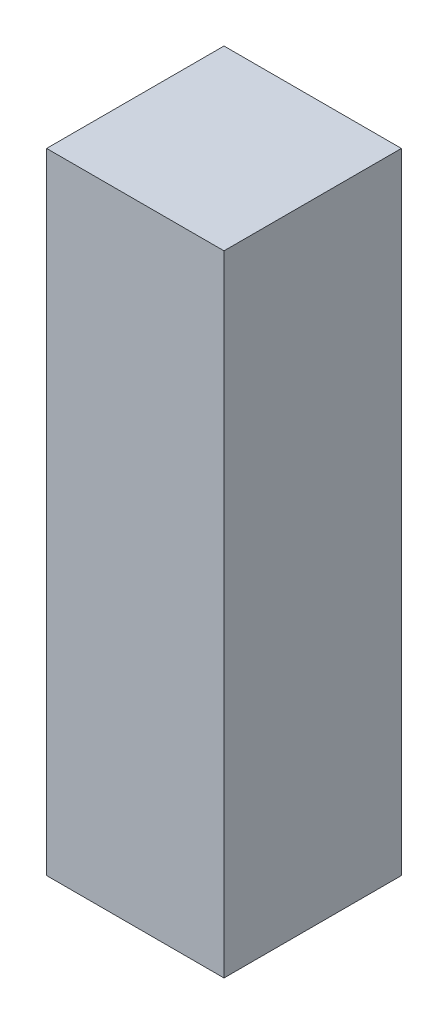
ISO-10303-21;
HEADER;
FILE_DESCRIPTION(('STEP AP214'),'2;1');
FILE_NAME('part.step','',(''),(''),'','','');
FILE_SCHEMA(('AUTOMOTIVE_DESIGN { 1 0 10303 214 1 1 1 1 }'));
ENDSEC;
DATA;
#1=APPLICATION_CONTEXT('core data for automotive mechanical design processes');
#2=APPLICATION_PROTOCOL_DEFINITION('international standard','automotive_design',2000,#1);
#3=PRODUCT_CONTEXT('',#1,'mechanical');
#4=PRODUCT('Part','Part','',(#3));
#5=PRODUCT_RELATED_PRODUCT_CATEGORY('part','',(#4));
#6=PRODUCT_DEFINITION_FORMATION('','',#4);
#7=PRODUCT_DEFINITION_CONTEXT('part definition',#1,'design');
#8=PRODUCT_DEFINITION('design','',#6,#7);
#9=PRODUCT_DEFINITION_SHAPE('','',#8);
#10=(LENGTH_UNIT() NAMED_UNIT(*) SI_UNIT(.MILLI.,.METRE.));
#11=(NAMED_UNIT(*) PLANE_ANGLE_UNIT() SI_UNIT($,.RADIAN.));
#12=(NAMED_UNIT(*) SI_UNIT($,.STERADIAN.) SOLID_ANGLE_UNIT());
#13=UNCERTAINTY_MEASURE_WITH_UNIT(LENGTH_MEASURE(1.E-05),#10,'distance_accuracy_value','');
#14=(GEOMETRIC_REPRESENTATION_CONTEXT(3) GLOBAL_UNCERTAINTY_ASSIGNED_CONTEXT((#13)) GLOBAL_UNIT_ASSIGNED_CONTEXT((#10,
#11,#12)) REPRESENTATION_CONTEXT('',''));
#15=CARTESIAN_POINT('',(0.,0.,0.));
#16=DIRECTION('',(0.,0.,1.));
#17=DIRECTION('',(1.,0.,0.));
#18=AXIS2_PLACEMENT_3D('',#15,#16,#17);
#19=CARTESIAN_POINT('',(0.,17.75,0.));
#20=DIRECTION('',(1.,0.,0.));
#21=DIRECTION('',(0.,0.,-1.));
#22=AXIS2_PLACEMENT_3D('',#19,#20,#21);
#23=PLANE('',#22);
#24=DIRECTION('',(0.,0.,1.));
#25=VECTOR('',#24,1.);
#26=CARTESIAN_POINT('',(0.,0.,0.));
#27=LINE('',#26,#25);
#28=CARTESIAN_POINT('',(0.,0.,-5.));
#29=VERTEX_POINT('',#28);
#30=CARTESIAN_POINT('',(0.,0.,0.));
#31=VERTEX_POINT('',#30);
#32=EDGE_CURVE('E102',#29,#31,#27,.T.);
#33=ORIENTED_EDGE('',*,*,#32,.T.);
#34=DIRECTION('',(0.,-1.,0.));
#35=VECTOR('',#34,1.);
#36=CARTESIAN_POINT('',(0.,17.75,0.));
#37=LINE('',#36,#35);
#38=CARTESIAN_POINT('',(0.,17.75,0.));
#39=VERTEX_POINT('',#38);
#40=EDGE_CURVE('E11',#39,#31,#37,.T.);
#41=ORIENTED_EDGE('',*,*,#40,.F.);
#42=DIRECTION('',(0.,0.,1.));
#43=VECTOR('',#42,1.);
#44=CARTESIAN_POINT('',(0.,17.75,0.));
#45=LINE('',#44,#43);
#46=CARTESIAN_POINT('',(0.,17.75,-5.));
#47=VERTEX_POINT('',#46);
#48=EDGE_CURVE('E90',#47,#39,#45,.T.);
#49=ORIENTED_EDGE('',*,*,#48,.F.);
#50=DIRECTION('',(0.,-1.,0.));
#51=VECTOR('',#50,1.);
#52=CARTESIAN_POINT('',(0.,17.75,-5.));
#53=LINE('',#52,#51);
#54=EDGE_CURVE('E98',#47,#29,#53,.T.);
#55=ORIENTED_EDGE('',*,*,#54,.T.);
#56=EDGE_LOOP('',(#33,#41,#49,#55));
#57=FACE_BOUND('',#56,.T.);
#58=ADVANCED_FACE('F39',(#57),#23,.F.);
#59=CARTESIAN_POINT('',(0.,17.75,0.));
#60=DIRECTION('',(0.,0.,-1.));
#61=DIRECTION('',(-1.,0.,0.));
#62=AXIS2_PLACEMENT_3D('',#59,#60,#61);
#63=PLANE('',#62);
#64=DIRECTION('',(1.,0.,0.));
#65=VECTOR('',#64,1.);
#66=CARTESIAN_POINT('',(0.,0.,0.));
#67=LINE('',#66,#65);
#68=CARTESIAN_POINT('',(5.,0.,0.));
#69=VERTEX_POINT('',#68);
#70=EDGE_CURVE('E94',#31,#69,#67,.T.);
#71=ORIENTED_EDGE('',*,*,#70,.T.);
#72=DIRECTION('',(0.,-1.,0.));
#73=VECTOR('',#72,1.);
#74=CARTESIAN_POINT('',(5.,17.75,0.));
#75=LINE('',#74,#73);
#76=CARTESIAN_POINT('',(5.,17.75,0.));
#77=VERTEX_POINT('',#76);
#78=EDGE_CURVE('E47',#77,#69,#75,.T.);
#79=ORIENTED_EDGE('',*,*,#78,.F.);
#80=DIRECTION('',(1.,0.,0.));
#81=VECTOR('',#80,1.);
#82=CARTESIAN_POINT('',(0.,17.75,0.));
#83=LINE('',#82,#81);
#84=EDGE_CURVE('E85',#39,#77,#83,.T.);
#85=ORIENTED_EDGE('',*,*,#84,.F.);
#86=ORIENTED_EDGE('',*,*,#40,.T.);
#87=EDGE_LOOP('',(#71,#79,#85,#86));
#88=FACE_BOUND('',#87,.T.);
#89=ADVANCED_FACE('F93',(#88),#63,.F.);
#90=CARTESIAN_POINT('',(5.,17.75,0.));
#91=DIRECTION('',(-1.,0.,0.));
#92=DIRECTION('',(0.,0.,1.));
#93=AXIS2_PLACEMENT_3D('',#90,#91,#92);
#94=PLANE('',#93);
#95=DIRECTION('',(0.,0.,-1.));
#96=VECTOR('',#95,1.);
#97=CARTESIAN_POINT('',(5.,0.,0.));
#98=LINE('',#97,#96);
#99=CARTESIAN_POINT('',(5.,0.,-5.));
#100=VERTEX_POINT('',#99);
#101=EDGE_CURVE('E72',#69,#100,#98,.T.);
#102=ORIENTED_EDGE('',*,*,#101,.T.);
#103=DIRECTION('',(0.,-1.,0.));
#104=VECTOR('',#103,1.);
#105=CARTESIAN_POINT('',(5.,17.75,-5.));
#106=LINE('',#105,#104);
#107=CARTESIAN_POINT('',(5.,17.75,-5.));
#108=VERTEX_POINT('',#107);
#109=EDGE_CURVE('E95',#108,#100,#106,.T.);
#110=ORIENTED_EDGE('',*,*,#109,.F.);
#111=DIRECTION('',(0.,0.,-1.));
#112=VECTOR('',#111,1.);
#113=CARTESIAN_POINT('',(5.,17.75,0.));
#114=LINE('',#113,#112);
#115=EDGE_CURVE('E88',#77,#108,#114,.T.);
#116=ORIENTED_EDGE('',*,*,#115,.F.);
#117=ORIENTED_EDGE('',*,*,#78,.T.);
#118=EDGE_LOOP('',(#102,#110,#116,#117));
#119=FACE_BOUND('',#118,.T.);
#120=ADVANCED_FACE('F96',(#119),#94,.F.);
#121=CARTESIAN_POINT('',(0.,17.75,-5.));
#122=DIRECTION('',(0.,0.,1.));
#123=DIRECTION('',(1.,0.,0.));
#124=AXIS2_PLACEMENT_3D('',#121,#122,#123);
#125=PLANE('',#124);
#126=DIRECTION('',(-1.,0.,0.));
#127=VECTOR('',#126,1.);
#128=CARTESIAN_POINT('',(0.,0.,-5.));
#129=LINE('',#128,#127);
#130=EDGE_CURVE('E78',#100,#29,#129,.T.);
#131=ORIENTED_EDGE('',*,*,#130,.T.);
#132=ORIENTED_EDGE('',*,*,#54,.F.);
#133=DIRECTION('',(-1.,0.,0.));
#134=VECTOR('',#133,1.);
#135=CARTESIAN_POINT('',(0.,17.75,-5.));
#136=LINE('',#135,#134);
#137=EDGE_CURVE('E55',#108,#47,#136,.T.);
#138=ORIENTED_EDGE('',*,*,#137,.F.);
#139=ORIENTED_EDGE('',*,*,#109,.T.);
#140=EDGE_LOOP('',(#131,#132,#138,#139));
#141=FACE_BOUND('',#140,.T.);
#142=ADVANCED_FACE('F109',(#141),#125,.F.);
#143=CARTESIAN_POINT('',(0.,17.75,0.));
#144=DIRECTION('',(0.,-1.,0.));
#145=DIRECTION('',(0.,0.,-1.));
#146=AXIS2_PLACEMENT_3D('',#143,#144,#145);
#147=PLANE('',#146);
#148=ORIENTED_EDGE('',*,*,#48,.T.);
#149=ORIENTED_EDGE('',*,*,#84,.T.);
#150=ORIENTED_EDGE('',*,*,#115,.T.);
#151=ORIENTED_EDGE('',*,*,#137,.T.);
#152=EDGE_LOOP('',(#148,#149,#150,#151));
#153=FACE_BOUND('',#152,.T.);
#154=ADVANCED_FACE('F86',(#153),#147,.F.);
#155=CARTESIAN_POINT('',(0.,0.,0.));
#156=DIRECTION('',(0.,-1.,0.));
#157=DIRECTION('',(0.,0.,-1.));
#158=AXIS2_PLACEMENT_3D('',#155,#156,#157);
#159=PLANE('',#158);
#160=ORIENTED_EDGE('',*,*,#32,.F.);
#161=ORIENTED_EDGE('',*,*,#130,.F.);
#162=ORIENTED_EDGE('',*,*,#101,.F.);
#163=ORIENTED_EDGE('',*,*,#70,.F.);
#164=EDGE_LOOP('',(#160,#161,#162,#163));
#165=FACE_BOUND('',#164,.T.);
#166=ADVANCED_FACE('F112',(#165),#159,.T.);
#167=CLOSED_SHELL('',(#58,#89,#120,#142,#154,#166));
#168=MANIFOLD_SOLID_BREP('B2',#167);
#169=ADVANCED_BREP_SHAPE_REPRESENTATION('',(#18,#168),#14);
#170=SHAPE_DEFINITION_REPRESENTATION(#9,#169);
ENDSEC;
END-ISO-10303-21;
